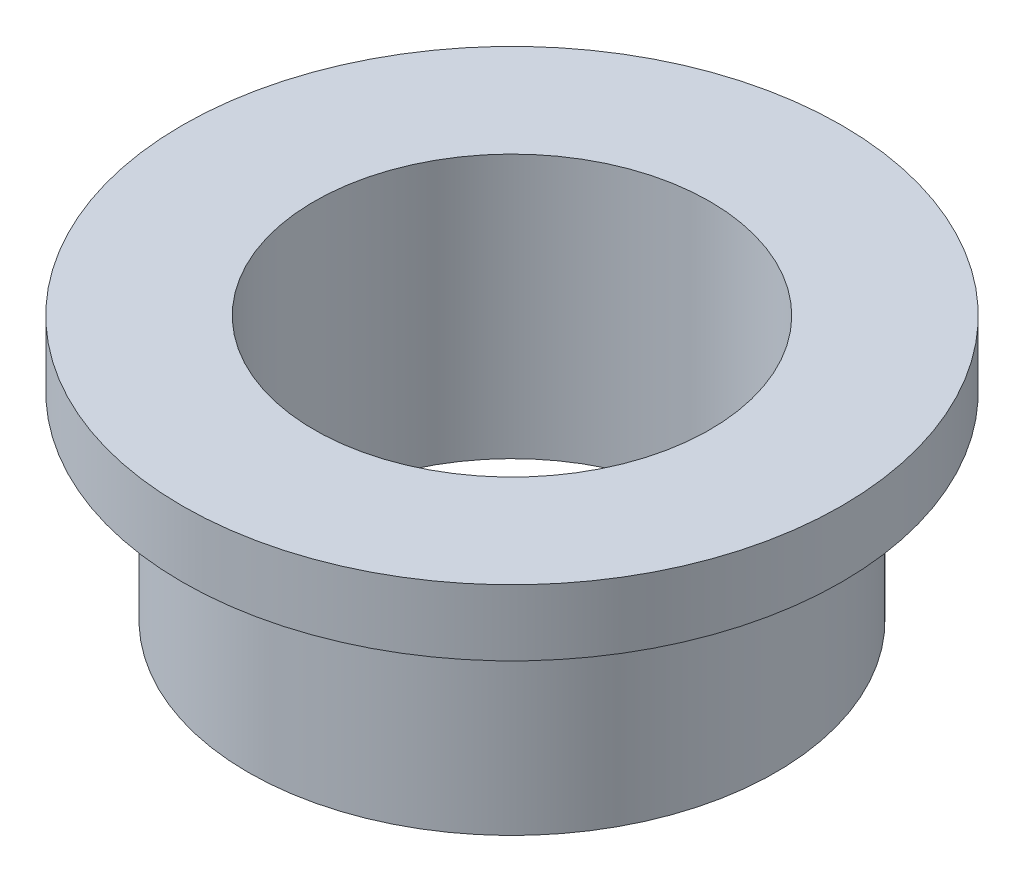
ISO-10303-21;
HEADER;
FILE_DESCRIPTION(('STEP AP214'),'2;1');
FILE_NAME('part.step','',(''),(''),'','','');
FILE_SCHEMA(('AUTOMOTIVE_DESIGN { 1 0 10303 214 1 1 1 1 }'));
ENDSEC;
DATA;
#1=APPLICATION_CONTEXT('core data for automotive mechanical design processes');
#2=APPLICATION_PROTOCOL_DEFINITION('international standard','automotive_design',2000,#1);
#3=PRODUCT_CONTEXT('',#1,'mechanical');
#4=PRODUCT('Part','Part','',(#3));
#5=PRODUCT_RELATED_PRODUCT_CATEGORY('part','',(#4));
#6=PRODUCT_DEFINITION_FORMATION('','',#4);
#7=PRODUCT_DEFINITION_CONTEXT('part definition',#1,'design');
#8=PRODUCT_DEFINITION('design','',#6,#7);
#9=PRODUCT_DEFINITION_SHAPE('','',#8);
#10=(LENGTH_UNIT() NAMED_UNIT(*) SI_UNIT(.MILLI.,.METRE.));
#11=(NAMED_UNIT(*) PLANE_ANGLE_UNIT() SI_UNIT($,.RADIAN.));
#12=(NAMED_UNIT(*) SI_UNIT($,.STERADIAN.) SOLID_ANGLE_UNIT());
#13=UNCERTAINTY_MEASURE_WITH_UNIT(LENGTH_MEASURE(1.E-05),#10,'distance_accuracy_value','');
#14=(GEOMETRIC_REPRESENTATION_CONTEXT(3) GLOBAL_UNCERTAINTY_ASSIGNED_CONTEXT((#13)) GLOBAL_UNIT_ASSIGNED_CONTEXT((#10,
#11,#12)) REPRESENTATION_CONTEXT('',''));
#15=CARTESIAN_POINT('',(0.,0.,0.));
#16=DIRECTION('',(0.,0.,1.));
#17=DIRECTION('',(1.,0.,0.));
#18=AXIS2_PLACEMENT_3D('',#15,#16,#17);
#19=CARTESIAN_POINT('',(0.,0.,-3.));
#20=DIRECTION('',(0.,-1.,0.));
#21=DIRECTION('',(0.,0.,-1.));
#22=AXIS2_PLACEMENT_3D('',#19,#20,#21);
#23=PLANE('',#22);
#24=CARTESIAN_POINT('',(0.,0.,0.));
#25=DIRECTION('',(0.,-1.,0.));
#26=DIRECTION('',(0.,0.,-1.));
#27=AXIS2_PLACEMENT_3D('',#24,#25,#26);
#28=CIRCLE('',#27,4.);
#29=CARTESIAN_POINT('',(0.,0.,-4.));
#30=VERTEX_POINT('',#29);
#31=EDGE_CURVE('E10',#30,#30,#28,.T.);
#32=ORIENTED_EDGE('',*,*,#31,.T.);
#33=EDGE_LOOP('',(#32));
#34=FACE_BOUND('',#33,.T.);
#35=CARTESIAN_POINT('',(0.,0.,0.));
#36=DIRECTION('',(0.,-1.,0.));
#37=DIRECTION('',(0.,0.,-1.));
#38=AXIS2_PLACEMENT_3D('',#35,#36,#37);
#39=CIRCLE('',#38,3.);
#40=CARTESIAN_POINT('',(0.,0.,-3.));
#41=VERTEX_POINT('',#40);
#42=EDGE_CURVE('E53',#41,#41,#39,.T.);
#43=ORIENTED_EDGE('',*,*,#42,.F.);
#44=EDGE_LOOP('',(#43));
#45=FACE_BOUND('',#44,.T.);
#46=ADVANCED_FACE('F31',(#34,#45),#23,.T.);
#47=CARTESIAN_POINT('',(0.,0.,0.));
#48=DIRECTION('',(0.,-1.,0.));
#49=DIRECTION('',(0.,0.,-1.));
#50=AXIS2_PLACEMENT_3D('',#47,#48,#49);
#51=CYLINDRICAL_SURFACE('',#50,4.);
#52=CARTESIAN_POINT('',(0.,3.,0.));
#53=DIRECTION('',(0.,-1.,0.));
#54=DIRECTION('',(0.,0.,-1.));
#55=AXIS2_PLACEMENT_3D('',#52,#53,#54);
#56=CIRCLE('',#55,4.);
#57=CARTESIAN_POINT('',(0.,3.,-4.));
#58=VERTEX_POINT('',#57);
#59=EDGE_CURVE('E37',#58,#58,#56,.T.);
#60=ORIENTED_EDGE('',*,*,#59,.T.);
#61=EDGE_LOOP('',(#60));
#62=FACE_BOUND('',#61,.T.);
#63=ORIENTED_EDGE('',*,*,#31,.F.);
#64=EDGE_LOOP('',(#63));
#65=FACE_BOUND('',#64,.T.);
#66=ADVANCED_FACE('F61',(#62,#65),#51,.T.);
#67=CARTESIAN_POINT('',(0.,3.,-4.));
#68=DIRECTION('',(0.,-1.,0.));
#69=DIRECTION('',(0.,0.,-1.));
#70=AXIS2_PLACEMENT_3D('',#67,#68,#69);
#71=PLANE('',#70);
#72=CARTESIAN_POINT('',(0.,3.,0.));
#73=DIRECTION('',(0.,-1.,0.));
#74=DIRECTION('',(0.,0.,-1.));
#75=AXIS2_PLACEMENT_3D('',#72,#73,#74);
#76=CIRCLE('',#75,5.);
#77=CARTESIAN_POINT('',(0.,3.,-5.));
#78=VERTEX_POINT('',#77);
#79=EDGE_CURVE('E41',#78,#78,#76,.T.);
#80=ORIENTED_EDGE('',*,*,#79,.T.);
#81=EDGE_LOOP('',(#80));
#82=FACE_BOUND('',#81,.T.);
#83=ORIENTED_EDGE('',*,*,#59,.F.);
#84=EDGE_LOOP('',(#83));
#85=FACE_BOUND('',#84,.T.);
#86=ADVANCED_FACE('F65',(#82,#85),#71,.T.);
#87=CARTESIAN_POINT('',(0.,0.,0.));
#88=DIRECTION('',(0.,-1.,0.));
#89=DIRECTION('',(0.,0.,-1.));
#90=AXIS2_PLACEMENT_3D('',#87,#88,#89);
#91=CYLINDRICAL_SURFACE('',#90,5.);
#92=CARTESIAN_POINT('',(0.,4.,0.));
#93=DIRECTION('',(0.,-1.,0.));
#94=DIRECTION('',(0.,0.,-1.));
#95=AXIS2_PLACEMENT_3D('',#92,#93,#94);
#96=CIRCLE('',#95,5.);
#97=CARTESIAN_POINT('',(0.,4.,-5.));
#98=VERTEX_POINT('',#97);
#99=EDGE_CURVE('E45',#98,#98,#96,.T.);
#100=ORIENTED_EDGE('',*,*,#99,.T.);
#101=EDGE_LOOP('',(#100));
#102=FACE_BOUND('',#101,.T.);
#103=ORIENTED_EDGE('',*,*,#79,.F.);
#104=EDGE_LOOP('',(#103));
#105=FACE_BOUND('',#104,.T.);
#106=ADVANCED_FACE('F69',(#102,#105),#91,.T.);
#107=CARTESIAN_POINT('',(0.,4.,-5.));
#108=DIRECTION('',(0.,1.,0.));
#109=DIRECTION('',(0.,0.,1.));
#110=AXIS2_PLACEMENT_3D('',#107,#108,#109);
#111=PLANE('',#110);
#112=CARTESIAN_POINT('',(0.,4.,0.));
#113=DIRECTION('',(0.,-1.,0.));
#114=DIRECTION('',(0.,0.,-1.));
#115=AXIS2_PLACEMENT_3D('',#112,#113,#114);
#116=CIRCLE('',#115,3.);
#117=CARTESIAN_POINT('',(0.,4.,-3.));
#118=VERTEX_POINT('',#117);
#119=EDGE_CURVE('E50',#118,#118,#116,.T.);
#120=ORIENTED_EDGE('',*,*,#119,.T.);
#121=EDGE_LOOP('',(#120));
#122=FACE_BOUND('',#121,.T.);
#123=ORIENTED_EDGE('',*,*,#99,.F.);
#124=EDGE_LOOP('',(#123));
#125=FACE_BOUND('',#124,.T.);
#126=ADVANCED_FACE('F76',(#122,#125),#111,.T.);
#127=CARTESIAN_POINT('',(0.,0.,0.));
#128=DIRECTION('',(0.,-1.,0.));
#129=DIRECTION('',(0.,0.,-1.));
#130=AXIS2_PLACEMENT_3D('',#127,#128,#129);
#131=CYLINDRICAL_SURFACE('',#130,3.);
#132=ORIENTED_EDGE('',*,*,#42,.T.);
#133=EDGE_LOOP('',(#132));
#134=FACE_BOUND('',#133,.T.);
#135=ORIENTED_EDGE('',*,*,#119,.F.);
#136=EDGE_LOOP('',(#135));
#137=FACE_BOUND('',#136,.T.);
#138=ADVANCED_FACE('F57',(#134,#137),#131,.F.);
#139=CLOSED_SHELL('',(#46,#66,#86,#106,#126,#138));
#140=MANIFOLD_SOLID_BREP('B2',#139);
#141=ADVANCED_BREP_SHAPE_REPRESENTATION('',(#18,#140),#14);
#142=SHAPE_DEFINITION_REPRESENTATION(#9,#141);
ENDSEC;
END-ISO-10303-21;
